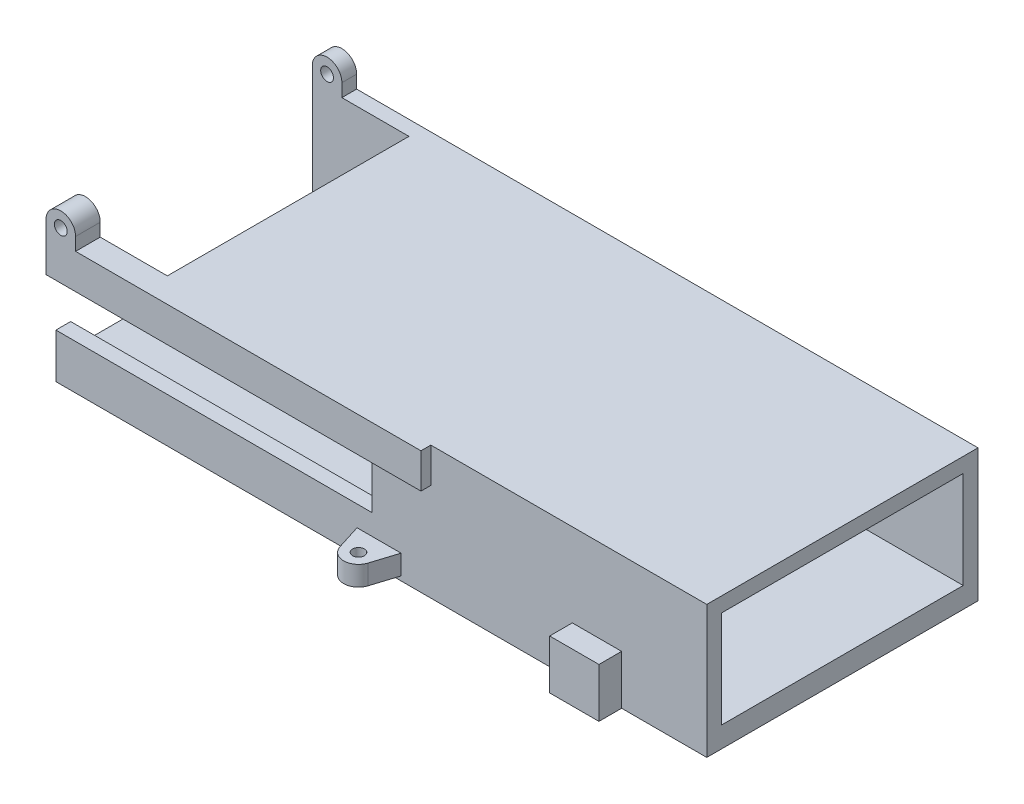
ISO-10303-21;
HEADER;
FILE_DESCRIPTION(('STEP AP214'),'2;1');
FILE_NAME('part.step','',(''),(''),'','','');
FILE_SCHEMA(('AUTOMOTIVE_DESIGN { 1 0 10303 214 1 1 1 1 }'));
ENDSEC;
DATA;
#1=APPLICATION_CONTEXT('core data for automotive mechanical design processes');
#2=APPLICATION_PROTOCOL_DEFINITION('international standard','automotive_design',2000,#1);
#3=PRODUCT_CONTEXT('',#1,'mechanical');
#4=PRODUCT('Part','Part','',(#3));
#5=PRODUCT_RELATED_PRODUCT_CATEGORY('part','',(#4));
#6=PRODUCT_DEFINITION_FORMATION('','',#4);
#7=PRODUCT_DEFINITION_CONTEXT('part definition',#1,'design');
#8=PRODUCT_DEFINITION('design','',#6,#7);
#9=PRODUCT_DEFINITION_SHAPE('','',#8);
#10=(LENGTH_UNIT() NAMED_UNIT(*) SI_UNIT(.MILLI.,.METRE.));
#11=(NAMED_UNIT(*) PLANE_ANGLE_UNIT() SI_UNIT($,.RADIAN.));
#12=(NAMED_UNIT(*) SI_UNIT($,.STERADIAN.) SOLID_ANGLE_UNIT());
#13=UNCERTAINTY_MEASURE_WITH_UNIT(LENGTH_MEASURE(1.E-05),#10,'distance_accuracy_value','');
#14=(GEOMETRIC_REPRESENTATION_CONTEXT(3) GLOBAL_UNCERTAINTY_ASSIGNED_CONTEXT((#13)) GLOBAL_UNIT_ASSIGNED_CONTEXT((#10,
#11,#12)) REPRESENTATION_CONTEXT('',''));
#15=CARTESIAN_POINT('',(0.,0.,0.));
#16=DIRECTION('',(0.,0.,1.));
#17=DIRECTION('',(1.,0.,0.));
#18=AXIS2_PLACEMENT_3D('',#15,#16,#17);
#19=CARTESIAN_POINT('',(66.,5.45,13.75));
#20=DIRECTION('',(0.,0.,-1.));
#21=DIRECTION('',(0.,1.,0.));
#22=AXIS2_PLACEMENT_3D('',#19,#20,#21);
#23=PLANE('',#22);
#24=DIRECTION('',(0.,1.,0.));
#25=VECTOR('',#24,1.);
#26=CARTESIAN_POINT('',(35.,-7.55,13.75));
#27=LINE('',#26,#25);
#28=CARTESIAN_POINT('',(35.,-7.55,13.75));
#29=VERTEX_POINT('',#28);
#30=CARTESIAN_POINT('',(35.,-5.55,13.75));
#31=VERTEX_POINT('',#30);
#32=EDGE_CURVE('E358',#29,#31,#27,.T.);
#33=ORIENTED_EDGE('',*,*,#32,.F.);
#34=DIRECTION('',(-1.,0.,0.));
#35=VECTOR('',#34,1.);
#36=CARTESIAN_POINT('',(30.5373487433569,-7.55,13.75));
#37=LINE('',#36,#35);
#38=CARTESIAN_POINT('',(30.5373487433569,-7.55,13.75));
#39=VERTEX_POINT('',#38);
#40=EDGE_CURVE('E335',#29,#39,#37,.T.);
#41=ORIENTED_EDGE('',*,*,#40,.T.);
#42=DIRECTION('',(0.,1.,0.));
#43=VECTOR('',#42,1.);
#44=CARTESIAN_POINT('',(30.5373487433569,-7.55,13.75));
#45=LINE('',#44,#43);
#46=CARTESIAN_POINT('',(30.5373487433569,-5.55,13.75));
#47=VERTEX_POINT('',#46);
#48=EDGE_CURVE('E347',#39,#47,#45,.T.);
#49=ORIENTED_EDGE('',*,*,#48,.T.);
#50=DIRECTION('',(-1.,0.,0.));
#51=VECTOR('',#50,1.);
#52=CARTESIAN_POINT('',(30.5373487433569,-5.55,13.75));
#53=LINE('',#52,#51);
#54=EDGE_CURVE('E332',#31,#47,#53,.T.);
#55=ORIENTED_EDGE('',*,*,#54,.F.);
#56=EDGE_LOOP('',(#33,#41,#49,#55));
#57=FACE_BOUND('',#56,.T.);
#58=DIRECTION('',(1.,0.,0.));
#59=VECTOR('',#58,1.);
#60=CARTESIAN_POINT('',(32.0584301535725,1.90832202250623,13.75));
#61=LINE('',#60,#59);
#62=CARTESIAN_POINT('',(32.0584301535725,1.90832202250623,13.75));
#63=VERTEX_POINT('',#62);
#64=CARTESIAN_POINT('',(38.0191295270022,1.90832202250623,13.75));
#65=VERTEX_POINT('',#64);
#66=EDGE_CURVE('E454',#63,#65,#61,.T.);
#67=ORIENTED_EDGE('',*,*,#66,.F.);
#68=DIRECTION('',(0.,1.,0.));
#69=VECTOR('',#68,1.);
#70=CARTESIAN_POINT('',(32.0584301535725,1.90832202250623,13.75));
#71=LINE('',#70,#69);
#72=CARTESIAN_POINT('',(32.0584301535725,-3.46021304864444,13.75));
#73=VERTEX_POINT('',#72);
#74=EDGE_CURVE('E500',#73,#63,#71,.T.);
#75=ORIENTED_EDGE('',*,*,#74,.F.);
#76=DIRECTION('',(1.,0.,0.));
#77=VECTOR('',#76,1.);
#78=CARTESIAN_POINT('',(-1.38428559922588,-3.46021304864444,13.75));
#79=LINE('',#78,#77);
#80=CARTESIAN_POINT('',(0.,-3.46021304864444,13.75));
#81=VERTEX_POINT('',#80);
#82=EDGE_CURVE('E493',#81,#73,#79,.T.);
#83=ORIENTED_EDGE('',*,*,#82,.F.);
#84=DIRECTION('',(0.,-1.,0.));
#85=VECTOR('',#84,1.);
#86=CARTESIAN_POINT('',(0.,5.45,13.75));
#87=LINE('',#86,#85);
#88=CARTESIAN_POINT('',(0.,-7.99,13.75));
#89=VERTEX_POINT('',#88);
#90=EDGE_CURVE('E272',#81,#89,#87,.T.);
#91=ORIENTED_EDGE('',*,*,#90,.T.);
#92=DIRECTION('',(1.,0.,0.));
#93=VECTOR('',#92,1.);
#94=CARTESIAN_POINT('',(-28.6372152975809,-7.99,13.75));
#95=LINE('',#94,#93);
#96=CARTESIAN_POINT('',(52.36605626,-7.99,13.75));
#97=VERTEX_POINT('',#96);
#98=EDGE_CURVE('E374',#89,#97,#95,.T.);
#99=ORIENTED_EDGE('',*,*,#98,.T.);
#100=DIRECTION('',(0.,-1.,0.));
#101=VECTOR('',#100,1.);
#102=CARTESIAN_POINT('',(52.36605626,-2.99,13.75));
#103=LINE('',#102,#101);
#104=CARTESIAN_POINT('',(52.36605626,-2.99,13.75));
#105=VERTEX_POINT('',#104);
#106=EDGE_CURVE('E65',#105,#97,#103,.T.);
#107=ORIENTED_EDGE('',*,*,#106,.F.);
#108=DIRECTION('',(1.,0.,0.));
#109=VECTOR('',#108,1.);
#110=CARTESIAN_POINT('',(52.36605626,-2.99,13.75));
#111=LINE('',#110,#109);
#112=CARTESIAN_POINT('',(57.36605626,-2.99,13.75));
#113=VERTEX_POINT('',#112);
#114=EDGE_CURVE('E60',#105,#113,#111,.T.);
#115=ORIENTED_EDGE('',*,*,#114,.T.);
#116=DIRECTION('',(0.,-1.,0.));
#117=VECTOR('',#116,1.);
#118=CARTESIAN_POINT('',(57.36605626,-2.99,13.75));
#119=LINE('',#118,#117);
#120=CARTESIAN_POINT('',(57.36605626,-7.99,13.75));
#121=VERTEX_POINT('',#120);
#122=EDGE_CURVE('E496',#113,#121,#119,.T.);
#123=ORIENTED_EDGE('',*,*,#122,.T.);
#124=CARTESIAN_POINT('',(66.,-7.99,13.75));
#125=VERTEX_POINT('',#124);
#126=EDGE_CURVE('E369',#121,#125,#95,.T.);
#127=ORIENTED_EDGE('',*,*,#126,.T.);
#128=DIRECTION('',(0.,-1.,0.));
#129=VECTOR('',#128,1.);
#130=CARTESIAN_POINT('',(66.,5.45,13.75));
#131=LINE('',#130,#129);
#132=CARTESIAN_POINT('',(66.,5.45,13.75));
#133=VERTEX_POINT('',#132);
#134=EDGE_CURVE('E276',#133,#125,#131,.T.);
#135=ORIENTED_EDGE('',*,*,#134,.F.);
#136=DIRECTION('',(-1.,0.,0.));
#137=VECTOR('',#136,1.);
#138=CARTESIAN_POINT('',(66.,5.45,13.75));
#139=LINE('',#138,#137);
#140=CARTESIAN_POINT('',(38.0191295270022,5.45,13.75));
#141=VERTEX_POINT('',#140);
#142=EDGE_CURVE('E287',#133,#141,#139,.T.);
#143=ORIENTED_EDGE('',*,*,#142,.T.);
#144=DIRECTION('',(0.,1.,0.));
#145=VECTOR('',#144,1.);
#146=CARTESIAN_POINT('',(38.0191295270022,1.90832202250623,13.75));
#147=LINE('',#146,#145);
#148=EDGE_CURVE('E452',#65,#141,#147,.T.);
#149=ORIENTED_EDGE('',*,*,#148,.F.);
#150=EDGE_LOOP('',(#67,#75,#83,#91,#99,#107,#115,#123,#127,#135,#143,#149));
#151=FACE_BOUND('',#150,.T.);
#152=ADVANCED_FACE('F45',(#57,#151),#23,.F.);
#153=CARTESIAN_POINT('',(0.,0.,0.));
#154=DIRECTION('',(-1.,0.,0.));
#155=DIRECTION('',(0.,0.,1.));
#156=AXIS2_PLACEMENT_3D('',#153,#154,#155);
#157=PLANE('',#156);
#158=DIRECTION('',(0.,0.,-1.));
#159=VECTOR('',#158,1.);
#160=CARTESIAN_POINT('',(0.,1.90832202250623,0.));
#161=LINE('',#160,#159);
#162=CARTESIAN_POINT('',(0.,1.90832202250623,14.75));
#163=VERTEX_POINT('',#162);
#164=CARTESIAN_POINT('',(0.,1.90832202250623,12.25));
#165=VERTEX_POINT('',#164);
#166=EDGE_CURVE('E322',#163,#165,#161,.T.);
#167=ORIENTED_EDGE('',*,*,#166,.F.);
#168=DIRECTION('',(0.,-1.,0.));
#169=VECTOR('',#168,1.);
#170=CARTESIAN_POINT('',(0.,6.75894513895662,14.75));
#171=LINE('',#170,#169);
#172=CARTESIAN_POINT('',(0.,6.75894513895662,14.75));
#173=VERTEX_POINT('',#172);
#174=EDGE_CURVE('E460',#173,#163,#171,.T.);
#175=ORIENTED_EDGE('',*,*,#174,.F.);
#176=DIRECTION('',(0.,0.,1.));
#177=VECTOR('',#176,1.);
#178=CARTESIAN_POINT('',(0.,6.75894513895662,-17.8597655399874));
#179=LINE('',#178,#177);
#180=CARTESIAN_POINT('',(0.,6.75894513895662,12.25));
#181=VERTEX_POINT('',#180);
#182=EDGE_CURVE('E399',#181,#173,#179,.T.);
#183=ORIENTED_EDGE('',*,*,#182,.F.);
#184=DIRECTION('',(0.,-1.,0.));
#185=VECTOR('',#184,1.);
#186=CARTESIAN_POINT('',(0.,3.95,12.25));
#187=LINE('',#186,#185);
#188=EDGE_CURVE('E267',#181,#165,#187,.T.);
#189=ORIENTED_EDGE('',*,*,#188,.T.);
#190=EDGE_LOOP('',(#167,#175,#183,#189));
#191=FACE_BOUND('',#190,.T.);
#192=ADVANCED_FACE('F509',(#191),#157,.T.);
#193=DIRECTION('',(0.,0.,1.));
#194=VECTOR('',#193,1.);
#195=CARTESIAN_POINT('',(0.,-5.89,12.25));
#196=LINE('',#195,#194);
#197=CARTESIAN_POINT('',(0.,-5.89,-12.25));
#198=VERTEX_POINT('',#197);
#199=CARTESIAN_POINT('',(0.,-5.89,12.25));
#200=VERTEX_POINT('',#199);
#201=EDGE_CURVE('E233',#198,#200,#196,.T.);
#202=ORIENTED_EDGE('',*,*,#201,.F.);
#203=DIRECTION('',(0.,1.,0.));
#204=VECTOR('',#203,1.);
#205=CARTESIAN_POINT('',(0.,3.95,-12.25));
#206=LINE('',#205,#204);
#207=CARTESIAN_POINT('',(0.,6.75894513895662,-12.25));
#208=VERTEX_POINT('',#207);
#209=EDGE_CURVE('E263',#198,#208,#206,.T.);
#210=ORIENTED_EDGE('',*,*,#209,.T.);
#211=CARTESIAN_POINT('',(0.,6.75894513895662,-13.75));
#212=VERTEX_POINT('',#211);
#213=EDGE_CURVE('E412',#212,#208,#179,.T.);
#214=ORIENTED_EDGE('',*,*,#213,.F.);
#215=DIRECTION('',(0.,1.,0.));
#216=VECTOR('',#215,1.);
#217=CARTESIAN_POINT('',(0.,5.45,-13.75));
#218=LINE('',#217,#216);
#219=CARTESIAN_POINT('',(0.,-7.99,-13.75));
#220=VERTEX_POINT('',#219);
#221=EDGE_CURVE('E277',#220,#212,#218,.T.);
#222=ORIENTED_EDGE('',*,*,#221,.F.);
#223=DIRECTION('',(0.,0.,-1.));
#224=VECTOR('',#223,1.);
#225=CARTESIAN_POINT('',(0.,-7.99,13.75));
#226=LINE('',#225,#224);
#227=EDGE_CURVE('E370',#89,#220,#226,.T.);
#228=ORIENTED_EDGE('',*,*,#227,.F.);
#229=ORIENTED_EDGE('',*,*,#90,.F.);
#230=DIRECTION('',(0.,0.,1.));
#231=VECTOR('',#230,1.);
#232=CARTESIAN_POINT('',(0.,-3.46021304864444,0.));
#233=LINE('',#232,#231);
#234=CARTESIAN_POINT('',(0.,-3.46021304864444,12.25));
#235=VERTEX_POINT('',#234);
#236=EDGE_CURVE('E316',#235,#81,#233,.T.);
#237=ORIENTED_EDGE('',*,*,#236,.F.);
#238=EDGE_CURVE('E265',#235,#200,#187,.T.);
#239=ORIENTED_EDGE('',*,*,#238,.T.);
#240=EDGE_LOOP('',(#202,#210,#214,#222,#228,#229,#237,#239));
#241=FACE_BOUND('',#240,.T.);
#242=ADVANCED_FACE('F320',(#241),#157,.T.);
#243=CARTESIAN_POINT('',(66.,5.45,13.75));
#244=DIRECTION('',(0.,-1.,0.));
#245=DIRECTION('',(0.,0.,-1.));
#246=AXIS2_PLACEMENT_3D('',#243,#244,#245);
#247=PLANE('',#246);
#248=DIRECTION('',(-1.,0.,0.));
#249=VECTOR('',#248,1.);
#250=CARTESIAN_POINT('',(66.,5.45,-12.25));
#251=LINE('',#250,#249);
#252=CARTESIAN_POINT('',(9.80254307661942,5.45,-12.25));
#253=VERTEX_POINT('',#252);
#254=CARTESIAN_POINT('',(3.,5.45,-12.25));
#255=VERTEX_POINT('',#254);
#256=EDGE_CURVE('E392',#253,#255,#251,.T.);
#257=ORIENTED_EDGE('',*,*,#256,.F.);
#258=DIRECTION('',(0.,0.,-1.));
#259=VECTOR('',#258,1.);
#260=CARTESIAN_POINT('',(9.80254307661942,5.45,13.75));
#261=LINE('',#260,#259);
#262=CARTESIAN_POINT('',(9.80254307661942,5.45,12.25));
#263=VERTEX_POINT('',#262);
#264=EDGE_CURVE('E397',#263,#253,#261,.T.);
#265=ORIENTED_EDGE('',*,*,#264,.F.);
#266=DIRECTION('',(1.,0.,0.));
#267=VECTOR('',#266,1.);
#268=CARTESIAN_POINT('',(66.,5.45,12.25));
#269=LINE('',#268,#267);
#270=CARTESIAN_POINT('',(3.,5.45,12.25));
#271=VERTEX_POINT('',#270);
#272=EDGE_CURVE('E300',#271,#263,#269,.T.);
#273=ORIENTED_EDGE('',*,*,#272,.F.);
#274=DIRECTION('',(0.,0.,1.));
#275=VECTOR('',#274,1.);
#276=CARTESIAN_POINT('',(3.,5.45,-17.8597655399874));
#277=LINE('',#276,#275);
#278=CARTESIAN_POINT('',(3.,5.45,14.75));
#279=VERTEX_POINT('',#278);
#280=EDGE_CURVE('E411',#271,#279,#277,.T.);
#281=ORIENTED_EDGE('',*,*,#280,.T.);
#282=DIRECTION('',(-1.,0.,0.));
#283=VECTOR('',#282,1.);
#284=CARTESIAN_POINT('',(38.0191295270022,5.45,14.75));
#285=LINE('',#284,#283);
#286=CARTESIAN_POINT('',(38.0191295270022,5.45,14.75));
#287=VERTEX_POINT('',#286);
#288=EDGE_CURVE('E444',#287,#279,#285,.T.);
#289=ORIENTED_EDGE('',*,*,#288,.F.);
#290=DIRECTION('',(0.,0.,-1.));
#291=VECTOR('',#290,1.);
#292=CARTESIAN_POINT('',(38.0191295270022,5.45,14.75));
#293=LINE('',#292,#291);
#294=EDGE_CURVE('E466',#287,#141,#293,.T.);
#295=ORIENTED_EDGE('',*,*,#294,.T.);
#296=ORIENTED_EDGE('',*,*,#142,.F.);
#297=DIRECTION('',(0.,0.,1.));
#298=VECTOR('',#297,1.);
#299=CARTESIAN_POINT('',(66.,5.45,13.75));
#300=LINE('',#299,#298);
#301=CARTESIAN_POINT('',(66.,5.45,-13.75));
#302=VERTEX_POINT('',#301);
#303=EDGE_CURVE('E273',#302,#133,#300,.T.);
#304=ORIENTED_EDGE('',*,*,#303,.F.);
#305=DIRECTION('',(-1.,0.,0.));
#306=VECTOR('',#305,1.);
#307=CARTESIAN_POINT('',(66.,5.45,-13.75));
#308=LINE('',#307,#306);
#309=CARTESIAN_POINT('',(3.,5.45,-13.75));
#310=VERTEX_POINT('',#309);
#311=EDGE_CURVE('E282',#302,#310,#308,.T.);
#312=ORIENTED_EDGE('',*,*,#311,.T.);
#313=EDGE_CURVE('E408',#310,#255,#277,.T.);
#314=ORIENTED_EDGE('',*,*,#313,.T.);
#315=EDGE_LOOP('',(#257,#265,#273,#281,#289,#295,#296,#304,#312,#314));
#316=FACE_BOUND('',#315,.T.);
#317=ADVANCED_FACE('F47',(#316),#247,.F.);
#318=CARTESIAN_POINT('',(66.,3.95,12.25));
#319=DIRECTION('',(0.,-1.,0.));
#320=DIRECTION('',(0.,0.,-1.));
#321=AXIS2_PLACEMENT_3D('',#318,#319,#320);
#322=PLANE('',#321);
#323=DIRECTION('',(-1.,0.,0.));
#324=VECTOR('',#323,1.);
#325=CARTESIAN_POINT('',(66.,3.95,12.25));
#326=LINE('',#325,#324);
#327=CARTESIAN_POINT('',(66.,3.95,12.25));
#328=VERTEX_POINT('',#327);
#329=CARTESIAN_POINT('',(9.80254307661942,3.95,12.25));
#330=VERTEX_POINT('',#329);
#331=EDGE_CURVE('E255',#328,#330,#326,.T.);
#332=ORIENTED_EDGE('',*,*,#331,.T.);
#333=DIRECTION('',(0.,0.,-1.));
#334=VECTOR('',#333,1.);
#335=CARTESIAN_POINT('',(9.80254307661942,3.95,12.25));
#336=LINE('',#335,#334);
#337=CARTESIAN_POINT('',(9.80254307661942,3.95,-12.25));
#338=VERTEX_POINT('',#337);
#339=EDGE_CURVE('E394',#330,#338,#336,.T.);
#340=ORIENTED_EDGE('',*,*,#339,.T.);
#341=DIRECTION('',(-1.,0.,0.));
#342=VECTOR('',#341,1.);
#343=CARTESIAN_POINT('',(66.,3.95,-12.25));
#344=LINE('',#343,#342);
#345=CARTESIAN_POINT('',(66.,3.95,-12.25));
#346=VERTEX_POINT('',#345);
#347=EDGE_CURVE('E258',#346,#338,#344,.T.);
#348=ORIENTED_EDGE('',*,*,#347,.F.);
#349=DIRECTION('',(0.,0.,1.));
#350=VECTOR('',#349,1.);
#351=CARTESIAN_POINT('',(66.,3.95,12.25));
#352=LINE('',#351,#350);
#353=EDGE_CURVE('E256',#346,#328,#352,.T.);
#354=ORIENTED_EDGE('',*,*,#353,.T.);
#355=EDGE_LOOP('',(#332,#340,#348,#354));
#356=FACE_BOUND('',#355,.T.);
#357=ADVANCED_FACE('F423',(#356),#322,.T.);
#358=CARTESIAN_POINT('',(3.,6.75894513895662,-17.8597655399874));
#359=DIRECTION('',(1.,0.,0.));
#360=DIRECTION('',(0.,1.,0.));
#361=AXIS2_PLACEMENT_3D('',#358,#359,#360);
#362=PLANE('',#361);
#363=DIRECTION('',(0.,0.,1.));
#364=VECTOR('',#363,1.);
#365=CARTESIAN_POINT('',(3.,6.75894513895662,-17.8597655399874));
#366=LINE('',#365,#364);
#367=CARTESIAN_POINT('',(3.,6.75894513895662,-13.75));
#368=VERTEX_POINT('',#367);
#369=CARTESIAN_POINT('',(3.,6.75894513895662,-12.25));
#370=VERTEX_POINT('',#369);
#371=EDGE_CURVE('E403',#368,#370,#366,.T.);
#372=ORIENTED_EDGE('',*,*,#371,.T.);
#373=DIRECTION('',(0.,-1.,0.));
#374=VECTOR('',#373,1.);
#375=CARTESIAN_POINT('',(3.,6.75894513895662,-12.25));
#376=LINE('',#375,#374);
#377=EDGE_CURVE('E389',#370,#255,#376,.T.);
#378=ORIENTED_EDGE('',*,*,#377,.T.);
#379=ORIENTED_EDGE('',*,*,#313,.F.);
#380=DIRECTION('',(0.,-1.,0.));
#381=VECTOR('',#380,1.);
#382=CARTESIAN_POINT('',(3.,6.75894513895662,-13.75));
#383=LINE('',#382,#381);
#384=EDGE_CURVE('E400',#368,#310,#383,.T.);
#385=ORIENTED_EDGE('',*,*,#384,.F.);
#386=EDGE_LOOP('',(#372,#378,#379,#385));
#387=FACE_BOUND('',#386,.T.);
#388=ADVANCED_FACE('F528',(#387),#362,.T.);
#389=ORIENTED_EDGE('',*,*,#280,.F.);
#390=DIRECTION('',(0.,1.,0.));
#391=VECTOR('',#390,1.);
#392=CARTESIAN_POINT('',(3.,6.75894513895662,12.25));
#393=LINE('',#392,#391);
#394=CARTESIAN_POINT('',(3.,6.75894513895662,12.25));
#395=VERTEX_POINT('',#394);
#396=EDGE_CURVE('E383',#271,#395,#393,.T.);
#397=ORIENTED_EDGE('',*,*,#396,.T.);
#398=CARTESIAN_POINT('',(3.,6.75894513895662,14.75));
#399=VERTEX_POINT('',#398);
#400=EDGE_CURVE('E407',#395,#399,#366,.T.);
#401=ORIENTED_EDGE('',*,*,#400,.T.);
#402=DIRECTION('',(0.,1.,0.));
#403=VECTOR('',#402,1.);
#404=CARTESIAN_POINT('',(3.,5.45,14.75));
#405=LINE('',#404,#403);
#406=EDGE_CURVE('E438',#279,#399,#405,.T.);
#407=ORIENTED_EDGE('',*,*,#406,.F.);
#408=EDGE_LOOP('',(#389,#397,#401,#407));
#409=FACE_BOUND('',#408,.T.);
#410=ADVANCED_FACE('F435',(#409),#362,.T.);
#411=CARTESIAN_POINT('',(1.5,6.75894513895662,-17.8597655399874));
#412=DIRECTION('',(0.,0.,1.));
#413=DIRECTION('',(1.,0.,0.));
#414=AXIS2_PLACEMENT_3D('',#411,#412,#413);
#415=CYLINDRICAL_SURFACE('',#414,1.5);
#416=ORIENTED_EDGE('',*,*,#213,.T.);
#417=CARTESIAN_POINT('',(1.5,6.75894513895662,-12.25));
#418=DIRECTION('',(0.,0.,1.));
#419=DIRECTION('',(1.,0.,0.));
#420=AXIS2_PLACEMENT_3D('',#417,#418,#419);
#421=CIRCLE('',#420,1.5);
#422=EDGE_CURVE('E299',#208,#370,#421,.F.);
#423=ORIENTED_EDGE('',*,*,#422,.T.);
#424=ORIENTED_EDGE('',*,*,#371,.F.);
#425=CARTESIAN_POINT('',(1.5,6.75894513895662,-13.75));
#426=DIRECTION('',(0.,0.,1.));
#427=DIRECTION('',(1.,0.,0.));
#428=AXIS2_PLACEMENT_3D('',#425,#426,#427);
#429=CIRCLE('',#428,1.5);
#430=EDGE_CURVE('E402',#212,#368,#429,.F.);
#431=ORIENTED_EDGE('',*,*,#430,.F.);
#432=EDGE_LOOP('',(#416,#423,#424,#431));
#433=FACE_BOUND('',#432,.T.);
#434=ADVANCED_FACE('F531',(#433),#415,.T.);
#435=ORIENTED_EDGE('',*,*,#400,.F.);
#436=CARTESIAN_POINT('',(1.5,6.75894513895662,12.25));
#437=DIRECTION('',(0.,0.,-1.));
#438=DIRECTION('',(-1.,0.,0.));
#439=AXIS2_PLACEMENT_3D('',#436,#437,#438);
#440=CIRCLE('',#439,1.5);
#441=EDGE_CURVE('E294',#395,#181,#440,.F.);
#442=ORIENTED_EDGE('',*,*,#441,.T.);
#443=ORIENTED_EDGE('',*,*,#182,.T.);
#444=CARTESIAN_POINT('',(1.5,6.75894513895662,14.75));
#445=DIRECTION('',(0.,0.,1.));
#446=DIRECTION('',(1.,0.,0.));
#447=AXIS2_PLACEMENT_3D('',#444,#445,#446);
#448=CIRCLE('',#447,1.5);
#449=EDGE_CURVE('E443',#399,#173,#448,.T.);
#450=ORIENTED_EDGE('',*,*,#449,.F.);
#451=EDGE_LOOP('',(#435,#442,#443,#450));
#452=FACE_BOUND('',#451,.T.);
#453=ADVANCED_FACE('F512',(#452),#415,.T.);
#454=CARTESIAN_POINT('',(1.5,6.75894513895662,-17.8597655399874));
#455=DIRECTION('',(0.,0.,1.));
#456=DIRECTION('',(1.,0.,0.));
#457=AXIS2_PLACEMENT_3D('',#454,#455,#456);
#458=CYLINDRICAL_SURFACE('',#457,0.65);
#459=CARTESIAN_POINT('',(1.5,6.75894513895662,-13.75));
#460=DIRECTION('',(0.,0.,1.));
#461=DIRECTION('',(1.,0.,0.));
#462=AXIS2_PLACEMENT_3D('',#459,#460,#461);
#463=CIRCLE('',#462,0.65);
#464=CARTESIAN_POINT('',(2.15,6.75894513895662,-13.75));
#465=VERTEX_POINT('',#464);
#466=EDGE_CURVE('E266',#465,#465,#463,.F.);
#467=ORIENTED_EDGE('',*,*,#466,.T.);
#468=EDGE_LOOP('',(#467));
#469=FACE_BOUND('',#468,.T.);
#470=CARTESIAN_POINT('',(1.5,6.75894513895662,-12.25));
#471=DIRECTION('',(0.,0.,1.));
#472=DIRECTION('',(1.,0.,0.));
#473=AXIS2_PLACEMENT_3D('',#470,#471,#472);
#474=CIRCLE('',#473,0.65);
#475=CARTESIAN_POINT('',(2.15,6.75894513895662,-12.25));
#476=VERTEX_POINT('',#475);
#477=EDGE_CURVE('E296',#476,#476,#474,.F.);
#478=ORIENTED_EDGE('',*,*,#477,.F.);
#479=EDGE_LOOP('',(#478));
#480=FACE_BOUND('',#479,.T.);
#481=ADVANCED_FACE('F583',(#469,#480),#458,.F.);
#482=CARTESIAN_POINT('',(1.5,6.75894513895662,12.25));
#483=DIRECTION('',(0.,0.,-1.));
#484=DIRECTION('',(-1.,0.,0.));
#485=AXIS2_PLACEMENT_3D('',#482,#483,#484);
#486=CIRCLE('',#485,0.65);
#487=CARTESIAN_POINT('',(0.85,6.75894513895662,12.25));
#488=VERTEX_POINT('',#487);
#489=EDGE_CURVE('E291',#488,#488,#486,.F.);
#490=ORIENTED_EDGE('',*,*,#489,.F.);
#491=EDGE_LOOP('',(#490));
#492=FACE_BOUND('',#491,.T.);
#493=CARTESIAN_POINT('',(1.5,6.75894513895662,14.75));
#494=DIRECTION('',(0.,0.,1.));
#495=DIRECTION('',(1.,0.,0.));
#496=AXIS2_PLACEMENT_3D('',#493,#494,#495);
#497=CIRCLE('',#496,0.65);
#498=CARTESIAN_POINT('',(2.15,6.75894513895662,14.75));
#499=VERTEX_POINT('',#498);
#500=EDGE_CURVE('E238',#499,#499,#497,.T.);
#501=ORIENTED_EDGE('',*,*,#500,.T.);
#502=EDGE_LOOP('',(#501));
#503=FACE_BOUND('',#502,.T.);
#504=ADVANCED_FACE('F572',(#492,#503),#458,.F.);
#505=CARTESIAN_POINT('',(66.,0.,0.));
#506=DIRECTION('',(-1.,0.,0.));
#507=DIRECTION('',(0.,0.,1.));
#508=AXIS2_PLACEMENT_3D('',#505,#506,#507);
#509=PLANE('',#508);
#510=DIRECTION('',(0.,1.,0.));
#511=VECTOR('',#510,1.);
#512=CARTESIAN_POINT('',(66.,3.95,-12.25));
#513=LINE('',#512,#511);
#514=CARTESIAN_POINT('',(66.,-5.89,-12.25));
#515=VERTEX_POINT('',#514);
#516=EDGE_CURVE('E247',#515,#346,#513,.T.);
#517=ORIENTED_EDGE('',*,*,#516,.F.);
#518=DIRECTION('',(0.,0.,1.));
#519=VECTOR('',#518,1.);
#520=CARTESIAN_POINT('',(66.,-5.89,12.25));
#521=LINE('',#520,#519);
#522=CARTESIAN_POINT('',(66.,-5.89,12.25));
#523=VERTEX_POINT('',#522);
#524=EDGE_CURVE('E231',#515,#523,#521,.T.);
#525=ORIENTED_EDGE('',*,*,#524,.T.);
#526=DIRECTION('',(0.,-1.,0.));
#527=VECTOR('',#526,1.);
#528=CARTESIAN_POINT('',(66.,3.95,12.25));
#529=LINE('',#528,#527);
#530=EDGE_CURVE('E246',#328,#523,#529,.T.);
#531=ORIENTED_EDGE('',*,*,#530,.F.);
#532=ORIENTED_EDGE('',*,*,#353,.F.);
#533=EDGE_LOOP('',(#517,#525,#531,#532));
#534=FACE_BOUND('',#533,.T.);
#535=ORIENTED_EDGE('',*,*,#134,.T.);
#536=DIRECTION('',(0.,0.,-1.));
#537=VECTOR('',#536,1.);
#538=CARTESIAN_POINT('',(66.,-7.99,13.75));
#539=LINE('',#538,#537);
#540=CARTESIAN_POINT('',(66.,-7.99,-13.75));
#541=VERTEX_POINT('',#540);
#542=EDGE_CURVE('E361',#125,#541,#539,.T.);
#543=ORIENTED_EDGE('',*,*,#542,.T.);
#544=DIRECTION('',(0.,1.,0.));
#545=VECTOR('',#544,1.);
#546=CARTESIAN_POINT('',(66.,5.45,-13.75));
#547=LINE('',#546,#545);
#548=EDGE_CURVE('E280',#541,#302,#547,.T.);
#549=ORIENTED_EDGE('',*,*,#548,.T.);
#550=ORIENTED_EDGE('',*,*,#303,.T.);
#551=EDGE_LOOP('',(#535,#543,#549,#550));
#552=FACE_BOUND('',#551,.T.);
#553=ADVANCED_FACE('F243',(#534,#552),#509,.F.);
#554=CARTESIAN_POINT('',(66.,5.45,-13.75));
#555=DIRECTION('',(0.,0.,1.));
#556=DIRECTION('',(1.,0.,0.));
#557=AXIS2_PLACEMENT_3D('',#554,#555,#556);
#558=PLANE('',#557);
#559=ORIENTED_EDGE('',*,*,#548,.F.);
#560=DIRECTION('',(1.,0.,0.));
#561=VECTOR('',#560,1.);
#562=CARTESIAN_POINT('',(-28.6372152975809,-7.99,-13.75));
#563=LINE('',#562,#561);
#564=EDGE_CURVE('E373',#220,#541,#563,.T.);
#565=ORIENTED_EDGE('',*,*,#564,.F.);
#566=ORIENTED_EDGE('',*,*,#221,.T.);
#567=ORIENTED_EDGE('',*,*,#430,.T.);
#568=ORIENTED_EDGE('',*,*,#384,.T.);
#569=ORIENTED_EDGE('',*,*,#311,.F.);
#570=EDGE_LOOP('',(#559,#565,#566,#567,#568,#569));
#571=FACE_BOUND('',#570,.T.);
#572=ORIENTED_EDGE('',*,*,#466,.F.);
#573=EDGE_LOOP('',(#572));
#574=FACE_BOUND('',#573,.T.);
#575=ADVANCED_FACE('F521',(#571,#574),#558,.F.);
#576=CARTESIAN_POINT('',(66.,3.95,-12.25));
#577=DIRECTION('',(0.,0.,1.));
#578=DIRECTION('',(0.,-1.,0.));
#579=AXIS2_PLACEMENT_3D('',#576,#577,#578);
#580=PLANE('',#579);
#581=DIRECTION('',(1.,0.,0.));
#582=VECTOR('',#581,1.);
#583=CARTESIAN_POINT('',(-24.5073458375239,-5.89,-12.25));
#584=LINE('',#583,#582);
#585=EDGE_CURVE('E248',#198,#515,#584,.T.);
#586=ORIENTED_EDGE('',*,*,#585,.T.);
#587=ORIENTED_EDGE('',*,*,#516,.T.);
#588=ORIENTED_EDGE('',*,*,#347,.T.);
#589=DIRECTION('',(0.,-1.,0.));
#590=VECTOR('',#589,1.);
#591=CARTESIAN_POINT('',(9.80254307661942,15.45,-12.25));
#592=LINE('',#591,#590);
#593=EDGE_CURVE('E295',#253,#338,#592,.T.);
#594=ORIENTED_EDGE('',*,*,#593,.F.);
#595=ORIENTED_EDGE('',*,*,#256,.T.);
#596=ORIENTED_EDGE('',*,*,#377,.F.);
#597=ORIENTED_EDGE('',*,*,#422,.F.);
#598=ORIENTED_EDGE('',*,*,#209,.F.);
#599=EDGE_LOOP('',(#586,#587,#588,#594,#595,#596,#597,#598));
#600=FACE_BOUND('',#599,.T.);
#601=ORIENTED_EDGE('',*,*,#477,.T.);
#602=EDGE_LOOP('',(#601));
#603=FACE_BOUND('',#602,.T.);
#604=ADVANCED_FACE('F418',(#600,#603),#580,.T.);
#605=CARTESIAN_POINT('',(66.,3.95,12.25));
#606=DIRECTION('',(0.,0.,-1.));
#607=DIRECTION('',(-1.,0.,0.));
#608=AXIS2_PLACEMENT_3D('',#605,#606,#607);
#609=PLANE('',#608);
#610=DIRECTION('',(1.,0.,0.));
#611=VECTOR('',#610,1.);
#612=CARTESIAN_POINT('',(-24.5073458375239,-5.89,12.25));
#613=LINE('',#612,#611);
#614=EDGE_CURVE('E227',#200,#523,#613,.T.);
#615=ORIENTED_EDGE('',*,*,#614,.F.);
#616=ORIENTED_EDGE('',*,*,#238,.F.);
#617=DIRECTION('',(-1.,0.,0.));
#618=VECTOR('',#617,1.);
#619=CARTESIAN_POINT('',(66.,-3.46021304864444,12.25));
#620=LINE('',#619,#618);
#621=CARTESIAN_POINT('',(32.0584301535725,-3.46021304864444,12.25));
#622=VERTEX_POINT('',#621);
#623=EDGE_CURVE('E290',#622,#235,#620,.T.);
#624=ORIENTED_EDGE('',*,*,#623,.F.);
#625=DIRECTION('',(0.,-1.,0.));
#626=VECTOR('',#625,1.);
#627=CARTESIAN_POINT('',(32.0584301535725,3.95,12.25));
#628=LINE('',#627,#626);
#629=CARTESIAN_POINT('',(32.0584301535725,1.90832202250623,12.25));
#630=VERTEX_POINT('',#629);
#631=EDGE_CURVE('E53',#630,#622,#628,.T.);
#632=ORIENTED_EDGE('',*,*,#631,.F.);
#633=DIRECTION('',(1.,0.,0.));
#634=VECTOR('',#633,1.);
#635=CARTESIAN_POINT('',(66.,1.90832202250623,12.25));
#636=LINE('',#635,#634);
#637=EDGE_CURVE('E11',#165,#630,#636,.T.);
#638=ORIENTED_EDGE('',*,*,#637,.F.);
#639=ORIENTED_EDGE('',*,*,#188,.F.);
#640=ORIENTED_EDGE('',*,*,#441,.F.);
#641=ORIENTED_EDGE('',*,*,#396,.F.);
#642=ORIENTED_EDGE('',*,*,#272,.T.);
#643=DIRECTION('',(0.,-1.,0.));
#644=VECTOR('',#643,1.);
#645=CARTESIAN_POINT('',(9.80254307661942,15.45,12.25));
#646=LINE('',#645,#644);
#647=EDGE_CURVE('E377',#263,#330,#646,.T.);
#648=ORIENTED_EDGE('',*,*,#647,.T.);
#649=ORIENTED_EDGE('',*,*,#331,.F.);
#650=ORIENTED_EDGE('',*,*,#530,.T.);
#651=EDGE_LOOP('',(#615,#616,#624,#632,#638,#639,#640,#641,#642,#648,#649,#650));
#652=FACE_BOUND('',#651,.T.);
#653=ORIENTED_EDGE('',*,*,#489,.T.);
#654=EDGE_LOOP('',(#653));
#655=FACE_BOUND('',#654,.T.);
#656=ADVANCED_FACE('F251',(#652,#655),#609,.T.);
#657=CARTESIAN_POINT('',(9.80254307661942,15.45,-12.25));
#658=DIRECTION('',(-1.,0.,0.));
#659=DIRECTION('',(0.,0.,1.));
#660=AXIS2_PLACEMENT_3D('',#657,#658,#659);
#661=PLANE('',#660);
#662=ORIENTED_EDGE('',*,*,#264,.T.);
#663=ORIENTED_EDGE('',*,*,#593,.T.);
#664=ORIENTED_EDGE('',*,*,#339,.F.);
#665=ORIENTED_EDGE('',*,*,#647,.F.);
#666=EDGE_LOOP('',(#662,#663,#664,#665));
#667=FACE_BOUND('',#666,.T.);
#668=ADVANCED_FACE('F426',(#667),#661,.T.);
#669=CARTESIAN_POINT('',(-28.6372152975809,-7.99,13.75));
#670=DIRECTION('',(0.,-1.,0.));
#671=DIRECTION('',(0.,0.,-1.));
#672=AXIS2_PLACEMENT_3D('',#669,#670,#671);
#673=PLANE('',#672);
#674=ORIENTED_EDGE('',*,*,#98,.F.);
#675=ORIENTED_EDGE('',*,*,#227,.T.);
#676=ORIENTED_EDGE('',*,*,#564,.T.);
#677=ORIENTED_EDGE('',*,*,#542,.F.);
#678=ORIENTED_EDGE('',*,*,#126,.F.);
#679=DIRECTION('',(0.,0.,1.));
#680=VECTOR('',#679,1.);
#681=CARTESIAN_POINT('',(57.36605626,-7.99,13.75));
#682=LINE('',#681,#680);
#683=CARTESIAN_POINT('',(57.36605626,-7.99,16.05));
#684=VERTEX_POINT('',#683);
#685=EDGE_CURVE('E486',#121,#684,#682,.T.);
#686=ORIENTED_EDGE('',*,*,#685,.T.);
#687=DIRECTION('',(-1.,0.,0.));
#688=VECTOR('',#687,1.);
#689=CARTESIAN_POINT('',(52.36605626,-7.99,16.05));
#690=LINE('',#689,#688);
#691=CARTESIAN_POINT('',(52.36605626,-7.99,16.05));
#692=VERTEX_POINT('',#691);
#693=EDGE_CURVE('E476',#684,#692,#690,.T.);
#694=ORIENTED_EDGE('',*,*,#693,.T.);
#695=DIRECTION('',(0.,0.,-1.));
#696=VECTOR('',#695,1.);
#697=CARTESIAN_POINT('',(52.36605626,-7.99,13.75));
#698=LINE('',#697,#696);
#699=EDGE_CURVE('E472',#692,#97,#698,.T.);
#700=ORIENTED_EDGE('',*,*,#699,.T.);
#701=EDGE_LOOP('',(#674,#675,#676,#677,#678,#686,#694,#700));
#702=FACE_BOUND('',#701,.T.);
#703=ADVANCED_FACE('F536',(#702),#673,.T.);
#704=CARTESIAN_POINT('',(34.1990106230791,-7.55,16.2857285077445));
#705=DIRECTION('',(0.953557500933766,0.,0.301211042979753));
#706=DIRECTION('',(0.301211042979753,0.,-0.953557500933766));
#707=AXIS2_PLACEMENT_3D('',#704,#705,#706);
#708=PLANE('',#707);
#709=DIRECTION('',(0.301211042979753,0.,-0.953557500933766));
#710=VECTOR('',#709,1.);
#711=CARTESIAN_POINT('',(34.1990106230791,-5.55,16.2857285077445));
#712=LINE('',#711,#710);
#713=CARTESIAN_POINT('',(34.1990106230791,-5.55,16.2857285077445));
#714=VERTEX_POINT('',#713);
#715=EDGE_CURVE('E338',#714,#31,#712,.T.);
#716=ORIENTED_EDGE('',*,*,#715,.F.);
#717=DIRECTION('',(0.,1.,0.));
#718=VECTOR('',#717,1.);
#719=CARTESIAN_POINT('',(34.1990106230791,-7.55,16.2857285077445));
#720=LINE('',#719,#718);
#721=CARTESIAN_POINT('',(34.1990106230791,-7.55,16.2857285077445));
#722=VERTEX_POINT('',#721);
#723=EDGE_CURVE('E362',#722,#714,#720,.T.);
#724=ORIENTED_EDGE('',*,*,#723,.F.);
#725=DIRECTION('',(0.301211042979753,0.,-0.953557500933766));
#726=VECTOR('',#725,1.);
#727=CARTESIAN_POINT('',(34.1990106230791,-7.55,16.2857285077445));
#728=LINE('',#727,#726);
#729=EDGE_CURVE('E344',#722,#29,#728,.T.);
#730=ORIENTED_EDGE('',*,*,#729,.T.);
#731=ORIENTED_EDGE('',*,*,#32,.T.);
#732=EDGE_LOOP('',(#716,#724,#730,#731));
#733=FACE_BOUND('',#732,.T.);
#734=ADVANCED_FACE('F591',(#733),#708,.T.);
#735=CARTESIAN_POINT('',(32.7686743716784,-7.55,15.8339119432749));
#736=DIRECTION('',(0.,1.,0.));
#737=DIRECTION('',(0.,0.,1.));
#738=AXIS2_PLACEMENT_3D('',#735,#736,#737);
#739=CYLINDRICAL_SURFACE('',#738,1.5);
#740=CARTESIAN_POINT('',(32.7686743716784,-5.55,15.8339119432749));
#741=DIRECTION('',(0.,1.,0.));
#742=DIRECTION('',(0.,0.,-1.));
#743=AXIS2_PLACEMENT_3D('',#740,#741,#742);
#744=CIRCLE('',#743,1.5);
#745=CARTESIAN_POINT('',(31.3383381202778,-5.55,16.2857285077445));
#746=VERTEX_POINT('',#745);
#747=EDGE_CURVE('E353',#746,#714,#744,.T.);
#748=ORIENTED_EDGE('',*,*,#747,.F.);
#749=DIRECTION('',(0.,1.,0.));
#750=VECTOR('',#749,1.);
#751=CARTESIAN_POINT('',(31.3383381202778,-7.55,16.2857285077445));
#752=LINE('',#751,#750);
#753=CARTESIAN_POINT('',(31.3383381202778,-7.55,16.2857285077445));
#754=VERTEX_POINT('',#753);
#755=EDGE_CURVE('E364',#754,#746,#752,.T.);
#756=ORIENTED_EDGE('',*,*,#755,.F.);
#757=CARTESIAN_POINT('',(32.7686743716784,-7.55,15.8339119432749));
#758=DIRECTION('',(0.,1.,0.));
#759=DIRECTION('',(0.,0.,-1.));
#760=AXIS2_PLACEMENT_3D('',#757,#758,#759);
#761=CIRCLE('',#760,1.5);
#762=EDGE_CURVE('E341',#754,#722,#761,.T.);
#763=ORIENTED_EDGE('',*,*,#762,.T.);
#764=ORIENTED_EDGE('',*,*,#723,.T.);
#765=EDGE_LOOP('',(#748,#756,#763,#764));
#766=FACE_BOUND('',#765,.T.);
#767=ADVANCED_FACE('F596',(#766),#739,.T.);
#768=CARTESIAN_POINT('',(30.5373487433569,-7.55,13.75));
#769=DIRECTION('',(-0.953557500933767,0.,0.30121104297975));
#770=DIRECTION('',(0.30121104297975,0.,0.953557500933767));
#771=AXIS2_PLACEMENT_3D('',#768,#769,#770);
#772=PLANE('',#771);
#773=DIRECTION('',(0.30121104297975,0.,0.953557500933767));
#774=VECTOR('',#773,1.);
#775=CARTESIAN_POINT('',(30.5373487433569,-5.55,13.75));
#776=LINE('',#775,#774);
#777=EDGE_CURVE('E350',#47,#746,#776,.T.);
#778=ORIENTED_EDGE('',*,*,#777,.F.);
#779=ORIENTED_EDGE('',*,*,#48,.F.);
#780=DIRECTION('',(0.30121104297975,0.,0.953557500933767));
#781=VECTOR('',#780,1.);
#782=CARTESIAN_POINT('',(30.5373487433569,-7.55,13.75));
#783=LINE('',#782,#781);
#784=EDGE_CURVE('E337',#39,#754,#783,.T.);
#785=ORIENTED_EDGE('',*,*,#784,.T.);
#786=ORIENTED_EDGE('',*,*,#755,.T.);
#787=EDGE_LOOP('',(#778,#779,#785,#786));
#788=FACE_BOUND('',#787,.T.);
#789=ADVANCED_FACE('F592',(#788),#772,.T.);
#790=CARTESIAN_POINT('',(32.7686743716784,-7.55,15.8339119432749));
#791=DIRECTION('',(0.,-1.,0.));
#792=DIRECTION('',(0.,0.,-1.));
#793=AXIS2_PLACEMENT_3D('',#790,#791,#792);
#794=PLANE('',#793);
#795=CARTESIAN_POINT('',(32.7686743716784,-7.55,15.8339119432749));
#796=DIRECTION('',(0.,1.,0.));
#797=DIRECTION('',(0.,0.,1.));
#798=AXIS2_PLACEMENT_3D('',#795,#796,#797);
#799=CIRCLE('',#798,0.6);
#800=CARTESIAN_POINT('',(32.7686743716784,-7.55,16.4339119432749));
#801=VERTEX_POINT('',#800);
#802=EDGE_CURVE('E329',#801,#801,#799,.T.);
#803=ORIENTED_EDGE('',*,*,#802,.T.);
#804=EDGE_LOOP('',(#803));
#805=FACE_BOUND('',#804,.T.);
#806=ORIENTED_EDGE('',*,*,#40,.F.);
#807=ORIENTED_EDGE('',*,*,#729,.F.);
#808=ORIENTED_EDGE('',*,*,#762,.F.);
#809=ORIENTED_EDGE('',*,*,#784,.F.);
#810=EDGE_LOOP('',(#806,#807,#808,#809));
#811=FACE_BOUND('',#810,.T.);
#812=ADVANCED_FACE('F595',(#805,#811),#794,.T.);
#813=CARTESIAN_POINT('',(32.7686743716784,-5.55,15.8339119432749));
#814=DIRECTION('',(0.,-1.,0.));
#815=DIRECTION('',(0.,0.,-1.));
#816=AXIS2_PLACEMENT_3D('',#813,#814,#815);
#817=PLANE('',#816);
#818=CARTESIAN_POINT('',(32.7686743716784,-5.55,15.8339119432749));
#819=DIRECTION('',(0.,1.,0.));
#820=DIRECTION('',(0.,0.,1.));
#821=AXIS2_PLACEMENT_3D('',#818,#819,#820);
#822=CIRCLE('',#821,0.6);
#823=CARTESIAN_POINT('',(32.7686743716784,-5.55,16.4339119432749));
#824=VERTEX_POINT('',#823);
#825=EDGE_CURVE('E324',#824,#824,#822,.T.);
#826=ORIENTED_EDGE('',*,*,#825,.F.);
#827=EDGE_LOOP('',(#826));
#828=FACE_BOUND('',#827,.T.);
#829=ORIENTED_EDGE('',*,*,#54,.T.);
#830=ORIENTED_EDGE('',*,*,#777,.T.);
#831=ORIENTED_EDGE('',*,*,#747,.T.);
#832=ORIENTED_EDGE('',*,*,#715,.T.);
#833=EDGE_LOOP('',(#829,#830,#831,#832));
#834=FACE_BOUND('',#833,.T.);
#835=ADVANCED_FACE('F604',(#828,#834),#817,.F.);
#836=CARTESIAN_POINT('',(32.7686743716784,-7.55,15.8339119432749));
#837=DIRECTION('',(0.,1.,0.));
#838=DIRECTION('',(0.,0.,1.));
#839=AXIS2_PLACEMENT_3D('',#836,#837,#838);
#840=CYLINDRICAL_SURFACE('',#839,0.6);
#841=ORIENTED_EDGE('',*,*,#802,.F.);
#842=EDGE_LOOP('',(#841));
#843=FACE_BOUND('',#842,.T.);
#844=ORIENTED_EDGE('',*,*,#825,.T.);
#845=EDGE_LOOP('',(#844));
#846=FACE_BOUND('',#845,.T.);
#847=ADVANCED_FACE('F607',(#843,#846),#840,.F.);
#848=CARTESIAN_POINT('',(-1.38428559922588,1.90832202250623,11.15));
#849=DIRECTION('',(0.,1.,0.));
#850=DIRECTION('',(0.,0.,1.));
#851=AXIS2_PLACEMENT_3D('',#848,#849,#850);
#852=PLANE('',#851);
#853=ORIENTED_EDGE('',*,*,#166,.T.);
#854=ORIENTED_EDGE('',*,*,#637,.T.);
#855=DIRECTION('',(0.,0.,1.));
#856=VECTOR('',#855,1.);
#857=CARTESIAN_POINT('',(32.0584301535725,1.90832202250623,11.15));
#858=LINE('',#857,#856);
#859=EDGE_CURVE('E311',#630,#63,#858,.T.);
#860=ORIENTED_EDGE('',*,*,#859,.T.);
#861=ORIENTED_EDGE('',*,*,#66,.T.);
#862=DIRECTION('',(0.,0.,-1.));
#863=VECTOR('',#862,1.);
#864=CARTESIAN_POINT('',(38.0191295270022,1.90832202250623,14.75));
#865=LINE('',#864,#863);
#866=CARTESIAN_POINT('',(38.0191295270022,1.90832202250623,14.75));
#867=VERTEX_POINT('',#866);
#868=EDGE_CURVE('E469',#867,#65,#865,.T.);
#869=ORIENTED_EDGE('',*,*,#868,.F.);
#870=DIRECTION('',(1.,0.,0.));
#871=VECTOR('',#870,1.);
#872=CARTESIAN_POINT('',(0.,1.90832202250623,14.75));
#873=LINE('',#872,#871);
#874=EDGE_CURVE('E463',#163,#867,#873,.T.);
#875=ORIENTED_EDGE('',*,*,#874,.F.);
#876=EDGE_LOOP('',(#853,#854,#860,#861,#869,#875));
#877=FACE_BOUND('',#876,.T.);
#878=ADVANCED_FACE('F505',(#877),#852,.F.);
#879=CARTESIAN_POINT('',(32.0584301535725,1.90832202250623,11.15));
#880=DIRECTION('',(1.,0.,0.));
#881=DIRECTION('',(0.,0.,-1.));
#882=AXIS2_PLACEMENT_3D('',#879,#880,#881);
#883=PLANE('',#882);
#884=ORIENTED_EDGE('',*,*,#631,.T.);
#885=DIRECTION('',(0.,0.,1.));
#886=VECTOR('',#885,1.);
#887=CARTESIAN_POINT('',(32.0584301535725,-3.46021304864444,11.15));
#888=LINE('',#887,#886);
#889=EDGE_CURVE('E308',#622,#73,#888,.T.);
#890=ORIENTED_EDGE('',*,*,#889,.T.);
#891=ORIENTED_EDGE('',*,*,#74,.T.);
#892=ORIENTED_EDGE('',*,*,#859,.F.);
#893=EDGE_LOOP('',(#884,#890,#891,#892));
#894=FACE_BOUND('',#893,.T.);
#895=ADVANCED_FACE('F306',(#894),#883,.F.);
#896=CARTESIAN_POINT('',(-1.38428559922588,-3.46021304864444,11.15));
#897=DIRECTION('',(0.,-1.,0.));
#898=DIRECTION('',(0.,0.,-1.));
#899=AXIS2_PLACEMENT_3D('',#896,#897,#898);
#900=PLANE('',#899);
#901=ORIENTED_EDGE('',*,*,#236,.T.);
#902=ORIENTED_EDGE('',*,*,#82,.T.);
#903=ORIENTED_EDGE('',*,*,#889,.F.);
#904=ORIENTED_EDGE('',*,*,#623,.T.);
#905=EDGE_LOOP('',(#901,#902,#903,#904));
#906=FACE_BOUND('',#905,.T.);
#907=ADVANCED_FACE('F315',(#906),#900,.F.);
#908=CARTESIAN_POINT('',(52.36605626,-2.99,13.75));
#909=DIRECTION('',(-1.,0.,0.));
#910=DIRECTION('',(0.,0.,1.));
#911=AXIS2_PLACEMENT_3D('',#908,#909,#910);
#912=PLANE('',#911);
#913=ORIENTED_EDGE('',*,*,#699,.F.);
#914=DIRECTION('',(0.,-1.,0.));
#915=VECTOR('',#914,1.);
#916=CARTESIAN_POINT('',(52.36605626,-2.99,16.05));
#917=LINE('',#916,#915);
#918=CARTESIAN_POINT('',(52.36605626,-2.99,16.05));
#919=VERTEX_POINT('',#918);
#920=EDGE_CURVE('E491',#919,#692,#917,.T.);
#921=ORIENTED_EDGE('',*,*,#920,.F.);
#922=DIRECTION('',(0.,0.,-1.));
#923=VECTOR('',#922,1.);
#924=CARTESIAN_POINT('',(52.36605626,-2.99,13.75));
#925=LINE('',#924,#923);
#926=EDGE_CURVE('E473',#919,#105,#925,.T.);
#927=ORIENTED_EDGE('',*,*,#926,.T.);
#928=ORIENTED_EDGE('',*,*,#106,.T.);
#929=EDGE_LOOP('',(#913,#921,#927,#928));
#930=FACE_BOUND('',#929,.T.);
#931=ADVANCED_FACE('F539',(#930),#912,.T.);
#932=CARTESIAN_POINT('',(52.36605626,-2.99,16.05));
#933=DIRECTION('',(0.,0.,1.));
#934=DIRECTION('',(1.,0.,0.));
#935=AXIS2_PLACEMENT_3D('',#932,#933,#934);
#936=PLANE('',#935);
#937=ORIENTED_EDGE('',*,*,#693,.F.);
#938=DIRECTION('',(0.,-1.,0.));
#939=VECTOR('',#938,1.);
#940=CARTESIAN_POINT('',(57.36605626,-2.99,16.05));
#941=LINE('',#940,#939);
#942=CARTESIAN_POINT('',(57.36605626,-2.99,16.05));
#943=VERTEX_POINT('',#942);
#944=EDGE_CURVE('E494',#943,#684,#941,.T.);
#945=ORIENTED_EDGE('',*,*,#944,.F.);
#946=DIRECTION('',(-1.,0.,0.));
#947=VECTOR('',#946,1.);
#948=CARTESIAN_POINT('',(52.36605626,-2.99,16.05));
#949=LINE('',#948,#947);
#950=EDGE_CURVE('E481',#943,#919,#949,.T.);
#951=ORIENTED_EDGE('',*,*,#950,.T.);
#952=ORIENTED_EDGE('',*,*,#920,.T.);
#953=EDGE_LOOP('',(#937,#945,#951,#952));
#954=FACE_BOUND('',#953,.T.);
#955=ADVANCED_FACE('F547',(#954),#936,.T.);
#956=CARTESIAN_POINT('',(57.36605626,-2.99,13.75));
#957=DIRECTION('',(1.,0.,0.));
#958=DIRECTION('',(0.,0.,-1.));
#959=AXIS2_PLACEMENT_3D('',#956,#957,#958);
#960=PLANE('',#959);
#961=ORIENTED_EDGE('',*,*,#685,.F.);
#962=ORIENTED_EDGE('',*,*,#122,.F.);
#963=DIRECTION('',(0.,0.,1.));
#964=VECTOR('',#963,1.);
#965=CARTESIAN_POINT('',(57.36605626,-2.99,13.75));
#966=LINE('',#965,#964);
#967=EDGE_CURVE('E478',#113,#943,#966,.T.);
#968=ORIENTED_EDGE('',*,*,#967,.T.);
#969=ORIENTED_EDGE('',*,*,#944,.T.);
#970=EDGE_LOOP('',(#961,#962,#968,#969));
#971=FACE_BOUND('',#970,.T.);
#972=ADVANCED_FACE('F550',(#971),#960,.T.);
#973=CARTESIAN_POINT('',(0.,-2.99,0.));
#974=DIRECTION('',(0.,1.,0.));
#975=DIRECTION('',(0.,0.,1.));
#976=AXIS2_PLACEMENT_3D('',#973,#974,#975);
#977=PLANE('',#976);
#978=ORIENTED_EDGE('',*,*,#926,.F.);
#979=ORIENTED_EDGE('',*,*,#950,.F.);
#980=ORIENTED_EDGE('',*,*,#967,.F.);
#981=ORIENTED_EDGE('',*,*,#114,.F.);
#982=EDGE_LOOP('',(#978,#979,#980,#981));
#983=FACE_BOUND('',#982,.T.);
#984=ADVANCED_FACE('F543',(#983),#977,.T.);
#985=CARTESIAN_POINT('',(1.5,6.75894513895662,14.75));
#986=DIRECTION('',(0.,0.,1.));
#987=DIRECTION('',(1.,0.,0.));
#988=AXIS2_PLACEMENT_3D('',#985,#986,#987);
#989=PLANE('',#988);
#990=ORIENTED_EDGE('',*,*,#288,.T.);
#991=ORIENTED_EDGE('',*,*,#406,.T.);
#992=ORIENTED_EDGE('',*,*,#449,.T.);
#993=ORIENTED_EDGE('',*,*,#174,.T.);
#994=ORIENTED_EDGE('',*,*,#874,.T.);
#995=DIRECTION('',(0.,1.,0.));
#996=VECTOR('',#995,1.);
#997=CARTESIAN_POINT('',(38.0191295270022,1.90832202250623,14.75));
#998=LINE('',#997,#996);
#999=EDGE_CURVE('E449',#867,#287,#998,.T.);
#1000=ORIENTED_EDGE('',*,*,#999,.T.);
#1001=EDGE_LOOP('',(#990,#991,#992,#993,#994,#1000));
#1002=FACE_BOUND('',#1001,.T.);
#1003=ORIENTED_EDGE('',*,*,#500,.F.);
#1004=EDGE_LOOP('',(#1003));
#1005=FACE_BOUND('',#1004,.T.);
#1006=ADVANCED_FACE('F446',(#1002,#1005),#989,.T.);
#1007=CARTESIAN_POINT('',(38.0191295270022,1.90832202250623,14.75));
#1008=DIRECTION('',(-1.,0.,0.));
#1009=DIRECTION('',(0.,0.,1.));
#1010=AXIS2_PLACEMENT_3D('',#1007,#1008,#1009);
#1011=PLANE('',#1010);
#1012=ORIENTED_EDGE('',*,*,#148,.T.);
#1013=ORIENTED_EDGE('',*,*,#294,.F.);
#1014=ORIENTED_EDGE('',*,*,#999,.F.);
#1015=ORIENTED_EDGE('',*,*,#868,.T.);
#1016=EDGE_LOOP('',(#1012,#1013,#1014,#1015));
#1017=FACE_BOUND('',#1016,.T.);
#1018=ADVANCED_FACE('F514',(#1017),#1011,.F.);
#1019=CARTESIAN_POINT('',(-24.5073458375239,-5.89,12.25));
#1020=DIRECTION('',(0.,1.,0.));
#1021=DIRECTION('',(0.,0.,1.));
#1022=AXIS2_PLACEMENT_3D('',#1019,#1020,#1021);
#1023=PLANE('',#1022);
#1024=ORIENTED_EDGE('',*,*,#585,.F.);
#1025=ORIENTED_EDGE('',*,*,#201,.T.);
#1026=ORIENTED_EDGE('',*,*,#614,.T.);
#1027=ORIENTED_EDGE('',*,*,#524,.F.);
#1028=EDGE_LOOP('',(#1024,#1025,#1026,#1027));
#1029=FACE_BOUND('',#1028,.T.);
#1030=ADVANCED_FACE('F230',(#1029),#1023,.T.);
#1031=CLOSED_SHELL('',(#152,#192,#242,#317,#357,#388,#410,#434,#453,#481,#504,#553,#575,#604,
#656,#668,#703,#734,#767,#789,#812,#835,#847,#878,#895,#907,#931,#955,#972,#984,#1006,#1018,#1030));
#1032=MANIFOLD_SOLID_BREP('B2',#1031);
#1033=ADVANCED_BREP_SHAPE_REPRESENTATION('',(#18,#1032),#14);
#1034=SHAPE_DEFINITION_REPRESENTATION(#9,#1033);
ENDSEC;
END-ISO-10303-21;
